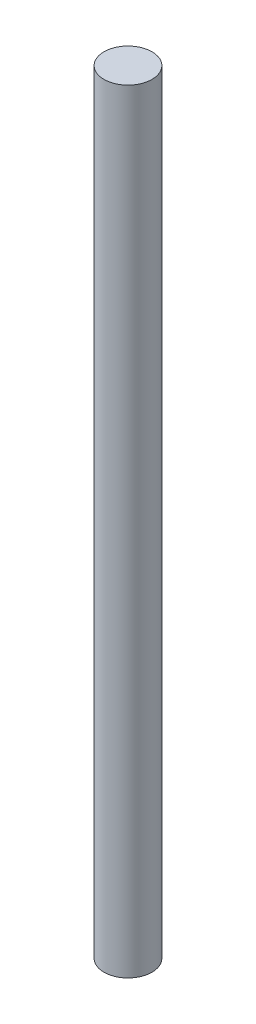
ISO-10303-21;
HEADER;
FILE_DESCRIPTION(('STEP AP214'),'2;1');
FILE_NAME('part.step','',(''),(''),'','','');
FILE_SCHEMA(('AUTOMOTIVE_DESIGN { 1 0 10303 214 1 1 1 1 }'));
ENDSEC;
DATA;
#1=APPLICATION_CONTEXT('core data for automotive mechanical design processes');
#2=APPLICATION_PROTOCOL_DEFINITION('international standard','automotive_design',2000,#1);
#3=PRODUCT_CONTEXT('',#1,'mechanical');
#4=PRODUCT('Part','Part','',(#3));
#5=PRODUCT_RELATED_PRODUCT_CATEGORY('part','',(#4));
#6=PRODUCT_DEFINITION_FORMATION('','',#4);
#7=PRODUCT_DEFINITION_CONTEXT('part definition',#1,'design');
#8=PRODUCT_DEFINITION('design','',#6,#7);
#9=PRODUCT_DEFINITION_SHAPE('','',#8);
#10=(LENGTH_UNIT() NAMED_UNIT(*) SI_UNIT(.MILLI.,.METRE.));
#11=(NAMED_UNIT(*) PLANE_ANGLE_UNIT() SI_UNIT($,.RADIAN.));
#12=(NAMED_UNIT(*) SI_UNIT($,.STERADIAN.) SOLID_ANGLE_UNIT());
#13=UNCERTAINTY_MEASURE_WITH_UNIT(LENGTH_MEASURE(1.E-05),#10,'distance_accuracy_value','');
#14=(GEOMETRIC_REPRESENTATION_CONTEXT(3) GLOBAL_UNCERTAINTY_ASSIGNED_CONTEXT((#13)) GLOBAL_UNIT_ASSIGNED_CONTEXT((#10,
#11,#12)) REPRESENTATION_CONTEXT('',''));
#15=CARTESIAN_POINT('',(0.,0.,0.));
#16=DIRECTION('',(0.,0.,1.));
#17=DIRECTION('',(1.,0.,0.));
#18=AXIS2_PLACEMENT_3D('',#15,#16,#17);
#19=CARTESIAN_POINT('',(0.,50.,0.));
#20=DIRECTION('',(0.,-1.,0.));
#21=DIRECTION('',(0.,0.,-1.));
#22=AXIS2_PLACEMENT_3D('',#19,#20,#21);
#23=CYLINDRICAL_SURFACE('',#22,1.55);
#24=CARTESIAN_POINT('',(0.,50.,0.));
#25=DIRECTION('',(0.,1.,0.));
#26=DIRECTION('',(0.,0.,1.));
#27=AXIS2_PLACEMENT_3D('',#24,#25,#26);
#28=CIRCLE('',#27,1.55);
#29=CARTESIAN_POINT('',(0.,50.,1.55));
#30=VERTEX_POINT('',#29);
#31=EDGE_CURVE('E10',#30,#30,#28,.T.);
#32=ORIENTED_EDGE('',*,*,#31,.F.);
#33=EDGE_LOOP('',(#32));
#34=FACE_BOUND('',#33,.T.);
#35=CARTESIAN_POINT('',(0.,0.,0.));
#36=DIRECTION('',(0.,1.,0.));
#37=DIRECTION('',(0.,0.,1.));
#38=AXIS2_PLACEMENT_3D('',#35,#36,#37);
#39=CIRCLE('',#38,1.55);
#40=CARTESIAN_POINT('',(0.,0.,1.55));
#41=VERTEX_POINT('',#40);
#42=EDGE_CURVE('E44',#41,#41,#39,.T.);
#43=ORIENTED_EDGE('',*,*,#42,.T.);
#44=EDGE_LOOP('',(#43));
#45=FACE_BOUND('',#44,.T.);
#46=ADVANCED_FACE('F41',(#34,#45),#23,.T.);
#47=CARTESIAN_POINT('',(0.,50.,0.));
#48=DIRECTION('',(0.,1.,0.));
#49=DIRECTION('',(0.,0.,1.));
#50=AXIS2_PLACEMENT_3D('',#47,#48,#49);
#51=PLANE('',#50);
#52=ORIENTED_EDGE('',*,*,#31,.T.);
#53=EDGE_LOOP('',(#52));
#54=FACE_BOUND('',#53,.T.);
#55=ADVANCED_FACE('F58',(#54),#51,.T.);
#56=CARTESIAN_POINT('',(0.,0.,0.));
#57=DIRECTION('',(0.,1.,0.));
#58=DIRECTION('',(0.,0.,1.));
#59=AXIS2_PLACEMENT_3D('',#56,#57,#58);
#60=PLANE('',#59);
#61=ORIENTED_EDGE('',*,*,#42,.F.);
#62=EDGE_LOOP('',(#61));
#63=FACE_BOUND('',#62,.T.);
#64=ADVANCED_FACE('F56',(#63),#60,.F.);
#65=CLOSED_SHELL('',(#46,#55,#64));
#66=MANIFOLD_SOLID_BREP('B2',#65);
#67=ADVANCED_BREP_SHAPE_REPRESENTATION('',(#18,#66),#14);
#68=SHAPE_DEFINITION_REPRESENTATION(#9,#67);
ENDSEC;
END-ISO-10303-21;
